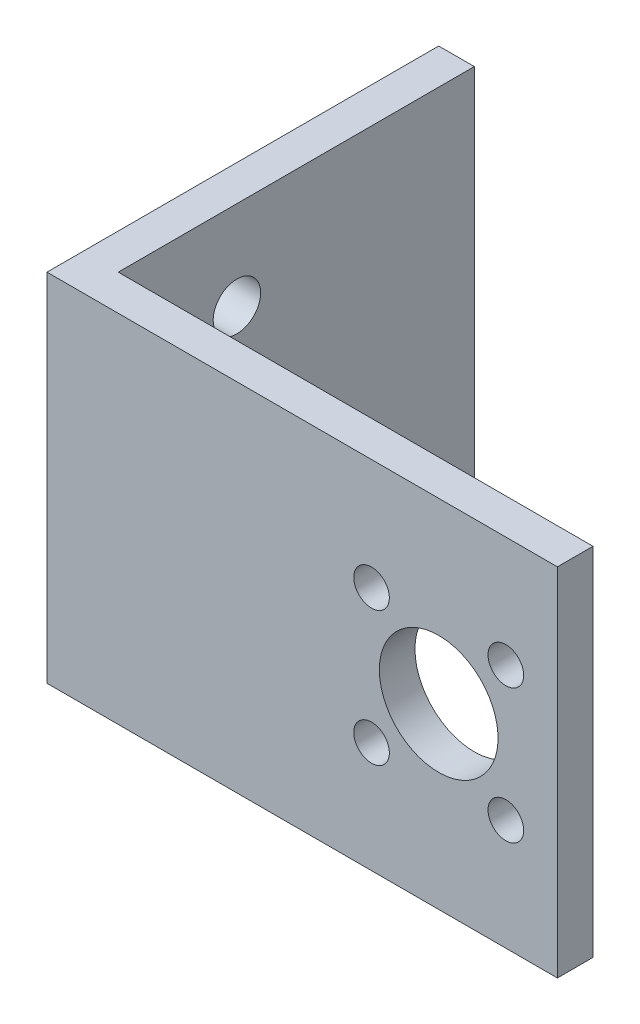
ISO-10303-21;
HEADER;
FILE_DESCRIPTION(('STEP AP214'),'2;1');
FILE_NAME('part.step','',(''),(''),'','','');
FILE_SCHEMA(('AUTOMOTIVE_DESIGN { 1 0 10303 214 1 1 1 1 }'));
ENDSEC;
DATA;
#1=APPLICATION_CONTEXT('core data for automotive mechanical design processes');
#2=APPLICATION_PROTOCOL_DEFINITION('international standard','automotive_design',2000,#1);
#3=PRODUCT_CONTEXT('',#1,'mechanical');
#4=PRODUCT('Part','Part','',(#3));
#5=PRODUCT_RELATED_PRODUCT_CATEGORY('part','',(#4));
#6=PRODUCT_DEFINITION_FORMATION('','',#4);
#7=PRODUCT_DEFINITION_CONTEXT('part definition',#1,'design');
#8=PRODUCT_DEFINITION('design','',#6,#7);
#9=PRODUCT_DEFINITION_SHAPE('','',#8);
#10=(LENGTH_UNIT() NAMED_UNIT(*) SI_UNIT(.MILLI.,.METRE.));
#11=(NAMED_UNIT(*) PLANE_ANGLE_UNIT() SI_UNIT($,.RADIAN.));
#12=(NAMED_UNIT(*) SI_UNIT($,.STERADIAN.) SOLID_ANGLE_UNIT());
#13=UNCERTAINTY_MEASURE_WITH_UNIT(LENGTH_MEASURE(1.E-05),#10,'distance_accuracy_value','');
#14=(GEOMETRIC_REPRESENTATION_CONTEXT(3) GLOBAL_UNCERTAINTY_ASSIGNED_CONTEXT((#13)) GLOBAL_UNIT_ASSIGNED_CONTEXT((#10,
#11,#12)) REPRESENTATION_CONTEXT('',''));
#15=CARTESIAN_POINT('',(0.,0.,0.));
#16=DIRECTION('',(0.,0.,1.));
#17=DIRECTION('',(1.,0.,0.));
#18=AXIS2_PLACEMENT_3D('',#15,#16,#17);
#19=CARTESIAN_POINT('',(0.,30.,-33.));
#20=DIRECTION('',(1.,0.,0.));
#21=DIRECTION('',(0.,0.,-1.));
#22=AXIS2_PLACEMENT_3D('',#19,#20,#21);
#23=PLANE('',#22);
#24=CARTESIAN_POINT('',(0.,22.5,-13.));
#25=DIRECTION('',(-1.,0.,0.));
#26=DIRECTION('',(0.,0.,1.));
#27=AXIS2_PLACEMENT_3D('',#24,#25,#26);
#28=CIRCLE('',#27,2.);
#29=CARTESIAN_POINT('',(0.,22.5,-11.));
#30=VERTEX_POINT('',#29);
#31=EDGE_CURVE('E164',#30,#30,#28,.T.);
#32=ORIENTED_EDGE('',*,*,#31,.F.);
#33=EDGE_LOOP('',(#32));
#34=FACE_BOUND('',#33,.T.);
#35=CARTESIAN_POINT('',(0.,7.5,-13.));
#36=DIRECTION('',(-1.,0.,0.));
#37=DIRECTION('',(0.,0.,1.));
#38=AXIS2_PLACEMENT_3D('',#35,#36,#37);
#39=CIRCLE('',#38,2.);
#40=CARTESIAN_POINT('',(0.,7.5,-11.));
#41=VERTEX_POINT('',#40);
#42=EDGE_CURVE('E167',#41,#41,#39,.T.);
#43=ORIENTED_EDGE('',*,*,#42,.F.);
#44=EDGE_LOOP('',(#43));
#45=FACE_BOUND('',#44,.T.);
#46=DIRECTION('',(0.,0.,1.));
#47=VECTOR('',#46,1.);
#48=CARTESIAN_POINT('',(0.,0.,-33.));
#49=LINE('',#48,#47);
#50=CARTESIAN_POINT('',(0.,0.,-33.));
#51=VERTEX_POINT('',#50);
#52=CARTESIAN_POINT('',(0.,0.,0.));
#53=VERTEX_POINT('',#52);
#54=EDGE_CURVE('E119',#51,#53,#49,.T.);
#55=ORIENTED_EDGE('',*,*,#54,.T.);
#56=DIRECTION('',(0.,-1.,0.));
#57=VECTOR('',#56,1.);
#58=CARTESIAN_POINT('',(0.,30.,0.));
#59=LINE('',#58,#57);
#60=CARTESIAN_POINT('',(0.,30.,0.));
#61=VERTEX_POINT('',#60);
#62=EDGE_CURVE('E11',#61,#53,#59,.T.);
#63=ORIENTED_EDGE('',*,*,#62,.F.);
#64=DIRECTION('',(0.,0.,1.));
#65=VECTOR('',#64,1.);
#66=CARTESIAN_POINT('',(0.,30.,-33.));
#67=LINE('',#66,#65);
#68=CARTESIAN_POINT('',(0.,30.,-33.));
#69=VERTEX_POINT('',#68);
#70=EDGE_CURVE('E130',#69,#61,#67,.T.);
#71=ORIENTED_EDGE('',*,*,#70,.F.);
#72=DIRECTION('',(0.,-1.,0.));
#73=VECTOR('',#72,1.);
#74=CARTESIAN_POINT('',(0.,30.,-33.));
#75=LINE('',#74,#73);
#76=EDGE_CURVE('E115',#69,#51,#75,.T.);
#77=ORIENTED_EDGE('',*,*,#76,.T.);
#78=EDGE_LOOP('',(#55,#63,#71,#77));
#79=FACE_BOUND('',#78,.T.);
#80=ADVANCED_FACE('F35',(#34,#45,#79),#23,.F.);
#81=CARTESIAN_POINT('',(0.,30.,0.));
#82=DIRECTION('',(0.,0.,-1.));
#83=DIRECTION('',(-1.,0.,0.));
#84=AXIS2_PLACEMENT_3D('',#81,#82,#83);
#85=PLANE('',#84);
#86=CARTESIAN_POINT('',(27.3431457505076,20.6568542494924,0.));
#87=DIRECTION('',(0.,0.,-1.));
#88=DIRECTION('',(-1.,0.,0.));
#89=AXIS2_PLACEMENT_3D('',#86,#87,#88);
#90=CIRCLE('',#89,1.5);
#91=CARTESIAN_POINT('',(25.8431457505076,20.6568542494924,0.));
#92=VERTEX_POINT('',#91);
#93=EDGE_CURVE('E203',#92,#92,#90,.F.);
#94=ORIENTED_EDGE('',*,*,#93,.F.);
#95=EDGE_LOOP('',(#94));
#96=FACE_BOUND('',#95,.T.);
#97=CARTESIAN_POINT('',(38.6568542494924,20.6568542494924,0.));
#98=DIRECTION('',(0.,0.,-1.));
#99=DIRECTION('',(-1.,0.,0.));
#100=AXIS2_PLACEMENT_3D('',#97,#98,#99);
#101=CIRCLE('',#100,1.50000000000001);
#102=CARTESIAN_POINT('',(37.1568542494924,20.6568542494924,0.));
#103=VERTEX_POINT('',#102);
#104=EDGE_CURVE('E197',#103,#103,#101,.F.);
#105=ORIENTED_EDGE('',*,*,#104,.F.);
#106=EDGE_LOOP('',(#105));
#107=FACE_BOUND('',#106,.T.);
#108=CARTESIAN_POINT('',(27.3431457505076,9.34314575050764,0.));
#109=DIRECTION('',(0.,0.,-1.));
#110=DIRECTION('',(-1.,0.,0.));
#111=AXIS2_PLACEMENT_3D('',#108,#109,#110);
#112=CIRCLE('',#111,1.5);
#113=CARTESIAN_POINT('',(25.8431457505076,9.34314575050764,0.));
#114=VERTEX_POINT('',#113);
#115=EDGE_CURVE('E191',#114,#114,#112,.F.);
#116=ORIENTED_EDGE('',*,*,#115,.F.);
#117=EDGE_LOOP('',(#116));
#118=FACE_BOUND('',#117,.T.);
#119=CARTESIAN_POINT('',(38.6568542494924,9.34314575050761,0.));
#120=DIRECTION('',(0.,0.,-1.));
#121=DIRECTION('',(-1.,0.,0.));
#122=AXIS2_PLACEMENT_3D('',#119,#120,#121);
#123=CIRCLE('',#122,1.50000000000001);
#124=CARTESIAN_POINT('',(37.1568542494924,9.34314575050761,0.));
#125=VERTEX_POINT('',#124);
#126=EDGE_CURVE('E185',#125,#125,#123,.F.);
#127=ORIENTED_EDGE('',*,*,#126,.F.);
#128=EDGE_LOOP('',(#127));
#129=FACE_BOUND('',#128,.T.);
#130=CARTESIAN_POINT('',(33.,15.,0.));
#131=DIRECTION('',(0.,0.,-1.));
#132=DIRECTION('',(-1.,0.,0.));
#133=AXIS2_PLACEMENT_3D('',#130,#131,#132);
#134=CIRCLE('',#133,5.);
#135=CARTESIAN_POINT('',(28.,15.,0.));
#136=VERTEX_POINT('',#135);
#137=EDGE_CURVE('E179',#136,#136,#134,.F.);
#138=ORIENTED_EDGE('',*,*,#137,.F.);
#139=EDGE_LOOP('',(#138));
#140=FACE_BOUND('',#139,.T.);
#141=DIRECTION('',(1.,0.,0.));
#142=VECTOR('',#141,1.);
#143=CARTESIAN_POINT('',(0.,0.,0.));
#144=LINE('',#143,#142);
#145=CARTESIAN_POINT('',(43.,0.,0.));
#146=VERTEX_POINT('',#145);
#147=EDGE_CURVE('E122',#53,#146,#144,.T.);
#148=ORIENTED_EDGE('',*,*,#147,.T.);
#149=DIRECTION('',(0.,-1.,0.));
#150=VECTOR('',#149,1.);
#151=CARTESIAN_POINT('',(43.,30.,0.));
#152=LINE('',#151,#150);
#153=CARTESIAN_POINT('',(43.,30.,0.));
#154=VERTEX_POINT('',#153);
#155=EDGE_CURVE('E43',#154,#146,#152,.T.);
#156=ORIENTED_EDGE('',*,*,#155,.F.);
#157=DIRECTION('',(1.,0.,0.));
#158=VECTOR('',#157,1.);
#159=CARTESIAN_POINT('',(0.,30.,0.));
#160=LINE('',#159,#158);
#161=EDGE_CURVE('E88',#61,#154,#160,.T.);
#162=ORIENTED_EDGE('',*,*,#161,.F.);
#163=ORIENTED_EDGE('',*,*,#62,.T.);
#164=EDGE_LOOP('',(#148,#156,#162,#163));
#165=FACE_BOUND('',#164,.T.);
#166=ADVANCED_FACE('F155',(#96,#107,#118,#129,#140,#165),#85,.F.);
#167=CARTESIAN_POINT('',(43.,30.,0.));
#168=DIRECTION('',(-1.,0.,0.));
#169=DIRECTION('',(0.,0.,1.));
#170=AXIS2_PLACEMENT_3D('',#167,#168,#169);
#171=PLANE('',#170);
#172=DIRECTION('',(0.,0.,-1.));
#173=VECTOR('',#172,1.);
#174=CARTESIAN_POINT('',(43.,0.,0.));
#175=LINE('',#174,#173);
#176=CARTESIAN_POINT('',(43.,0.,-2.99999999999999));
#177=VERTEX_POINT('',#176);
#178=EDGE_CURVE('E125',#146,#177,#175,.T.);
#179=ORIENTED_EDGE('',*,*,#178,.T.);
#180=DIRECTION('',(0.,-1.,0.));
#181=VECTOR('',#180,1.);
#182=CARTESIAN_POINT('',(43.,30.,-2.99999999999999));
#183=LINE('',#182,#181);
#184=CARTESIAN_POINT('',(43.,30.,-2.99999999999999));
#185=VERTEX_POINT('',#184);
#186=EDGE_CURVE('E110',#185,#177,#183,.T.);
#187=ORIENTED_EDGE('',*,*,#186,.F.);
#188=DIRECTION('',(0.,0.,-1.));
#189=VECTOR('',#188,1.);
#190=CARTESIAN_POINT('',(43.,30.,0.));
#191=LINE('',#190,#189);
#192=EDGE_CURVE('E101',#154,#185,#191,.T.);
#193=ORIENTED_EDGE('',*,*,#192,.F.);
#194=ORIENTED_EDGE('',*,*,#155,.T.);
#195=EDGE_LOOP('',(#179,#187,#193,#194));
#196=FACE_BOUND('',#195,.T.);
#197=ADVANCED_FACE('F136',(#196),#171,.F.);
#198=CARTESIAN_POINT('',(43.,30.,-2.99999999999999));
#199=DIRECTION('',(0.,0.,1.));
#200=DIRECTION('',(1.,0.,0.));
#201=AXIS2_PLACEMENT_3D('',#198,#199,#200);
#202=PLANE('',#201);
#203=CARTESIAN_POINT('',(27.3431457505076,20.6568542494924,-2.99999999999999));
#204=DIRECTION('',(0.,0.,-1.));
#205=DIRECTION('',(-1.,0.,0.));
#206=AXIS2_PLACEMENT_3D('',#203,#204,#205);
#207=CIRCLE('',#206,1.5);
#208=CARTESIAN_POINT('',(25.8431457505076,20.6568542494924,-2.99999999999999));
#209=VERTEX_POINT('',#208);
#210=EDGE_CURVE('E206',#209,#209,#207,.T.);
#211=ORIENTED_EDGE('',*,*,#210,.F.);
#212=EDGE_LOOP('',(#211));
#213=FACE_BOUND('',#212,.T.);
#214=CARTESIAN_POINT('',(38.6568542494924,20.6568542494924,-2.99999999999999));
#215=DIRECTION('',(0.,0.,-1.));
#216=DIRECTION('',(-1.,0.,0.));
#217=AXIS2_PLACEMENT_3D('',#214,#215,#216);
#218=CIRCLE('',#217,1.50000000000001);
#219=CARTESIAN_POINT('',(37.1568542494924,20.6568542494924,-2.99999999999999));
#220=VERTEX_POINT('',#219);
#221=EDGE_CURVE('E200',#220,#220,#218,.T.);
#222=ORIENTED_EDGE('',*,*,#221,.F.);
#223=EDGE_LOOP('',(#222));
#224=FACE_BOUND('',#223,.T.);
#225=CARTESIAN_POINT('',(27.3431457505076,9.34314575050764,-2.99999999999999));
#226=DIRECTION('',(0.,0.,-1.));
#227=DIRECTION('',(-1.,0.,0.));
#228=AXIS2_PLACEMENT_3D('',#225,#226,#227);
#229=CIRCLE('',#228,1.5);
#230=CARTESIAN_POINT('',(25.8431457505076,9.34314575050764,-2.99999999999999));
#231=VERTEX_POINT('',#230);
#232=EDGE_CURVE('E194',#231,#231,#229,.T.);
#233=ORIENTED_EDGE('',*,*,#232,.F.);
#234=EDGE_LOOP('',(#233));
#235=FACE_BOUND('',#234,.T.);
#236=CARTESIAN_POINT('',(38.6568542494924,9.34314575050761,-2.99999999999999));
#237=DIRECTION('',(0.,0.,-1.));
#238=DIRECTION('',(-1.,0.,0.));
#239=AXIS2_PLACEMENT_3D('',#236,#237,#238);
#240=CIRCLE('',#239,1.50000000000001);
#241=CARTESIAN_POINT('',(37.1568542494924,9.34314575050761,-2.99999999999999));
#242=VERTEX_POINT('',#241);
#243=EDGE_CURVE('E188',#242,#242,#240,.T.);
#244=ORIENTED_EDGE('',*,*,#243,.F.);
#245=EDGE_LOOP('',(#244));
#246=FACE_BOUND('',#245,.T.);
#247=CARTESIAN_POINT('',(33.,15.,-2.99999999999999));
#248=DIRECTION('',(0.,0.,-1.));
#249=DIRECTION('',(-1.,0.,0.));
#250=AXIS2_PLACEMENT_3D('',#247,#248,#249);
#251=CIRCLE('',#250,5.);
#252=CARTESIAN_POINT('',(28.,15.,-2.99999999999999));
#253=VERTEX_POINT('',#252);
#254=EDGE_CURVE('E182',#253,#253,#251,.T.);
#255=ORIENTED_EDGE('',*,*,#254,.F.);
#256=EDGE_LOOP('',(#255));
#257=FACE_BOUND('',#256,.T.);
#258=DIRECTION('',(-1.,0.,0.));
#259=VECTOR('',#258,1.);
#260=CARTESIAN_POINT('',(43.,0.,-2.99999999999999));
#261=LINE('',#260,#259);
#262=CARTESIAN_POINT('',(3.,0.,-2.99999999999999));
#263=VERTEX_POINT('',#262);
#264=EDGE_CURVE('E109',#177,#263,#261,.T.);
#265=ORIENTED_EDGE('',*,*,#264,.T.);
#266=DIRECTION('',(0.,-1.,0.));
#267=VECTOR('',#266,1.);
#268=CARTESIAN_POINT('',(3.,30.,-2.99999999999999));
#269=LINE('',#268,#267);
#270=CARTESIAN_POINT('',(3.,30.,-2.99999999999999));
#271=VERTEX_POINT('',#270);
#272=EDGE_CURVE('E106',#271,#263,#269,.T.);
#273=ORIENTED_EDGE('',*,*,#272,.F.);
#274=DIRECTION('',(-1.,0.,0.));
#275=VECTOR('',#274,1.);
#276=CARTESIAN_POINT('',(43.,30.,-2.99999999999999));
#277=LINE('',#276,#275);
#278=EDGE_CURVE('E95',#185,#271,#277,.T.);
#279=ORIENTED_EDGE('',*,*,#278,.F.);
#280=ORIENTED_EDGE('',*,*,#186,.T.);
#281=EDGE_LOOP('',(#265,#273,#279,#280));
#282=FACE_BOUND('',#281,.T.);
#283=ADVANCED_FACE('F107',(#213,#224,#235,#246,#257,#282),#202,.F.);
#284=CARTESIAN_POINT('',(3.,30.,-2.99999999999999));
#285=DIRECTION('',(-1.,0.,0.));
#286=DIRECTION('',(0.,0.,1.));
#287=AXIS2_PLACEMENT_3D('',#284,#285,#286);
#288=PLANE('',#287);
#289=CARTESIAN_POINT('',(3.,22.5,-13.));
#290=DIRECTION('',(-1.,0.,0.));
#291=DIRECTION('',(0.,0.,1.));
#292=AXIS2_PLACEMENT_3D('',#289,#290,#291);
#293=CIRCLE('',#292,2.);
#294=CARTESIAN_POINT('',(3.,22.5,-11.));
#295=VERTEX_POINT('',#294);
#296=EDGE_CURVE('E169',#295,#295,#293,.F.);
#297=ORIENTED_EDGE('',*,*,#296,.F.);
#298=EDGE_LOOP('',(#297));
#299=FACE_BOUND('',#298,.T.);
#300=CARTESIAN_POINT('',(3.,7.5,-13.));
#301=DIRECTION('',(-1.,0.,0.));
#302=DIRECTION('',(0.,0.,1.));
#303=AXIS2_PLACEMENT_3D('',#300,#301,#302);
#304=CIRCLE('',#303,2.);
#305=CARTESIAN_POINT('',(3.,7.5,-11.));
#306=VERTEX_POINT('',#305);
#307=EDGE_CURVE('E123',#306,#306,#304,.F.);
#308=ORIENTED_EDGE('',*,*,#307,.F.);
#309=EDGE_LOOP('',(#308));
#310=FACE_BOUND('',#309,.T.);
#311=DIRECTION('',(0.,0.,-1.));
#312=VECTOR('',#311,1.);
#313=CARTESIAN_POINT('',(3.,0.,-2.99999999999999));
#314=LINE('',#313,#312);
#315=CARTESIAN_POINT('',(2.99999999999999,0.,-33.));
#316=VERTEX_POINT('',#315);
#317=EDGE_CURVE('E74',#263,#316,#314,.T.);
#318=ORIENTED_EDGE('',*,*,#317,.T.);
#319=DIRECTION('',(0.,-1.,0.));
#320=VECTOR('',#319,1.);
#321=CARTESIAN_POINT('',(2.99999999999999,30.,-33.));
#322=LINE('',#321,#320);
#323=CARTESIAN_POINT('',(2.99999999999999,30.,-33.));
#324=VERTEX_POINT('',#323);
#325=EDGE_CURVE('E111',#324,#316,#322,.T.);
#326=ORIENTED_EDGE('',*,*,#325,.F.);
#327=DIRECTION('',(0.,0.,-1.));
#328=VECTOR('',#327,1.);
#329=CARTESIAN_POINT('',(3.,30.,-2.99999999999999));
#330=LINE('',#329,#328);
#331=EDGE_CURVE('E99',#271,#324,#330,.T.);
#332=ORIENTED_EDGE('',*,*,#331,.F.);
#333=ORIENTED_EDGE('',*,*,#272,.T.);
#334=EDGE_LOOP('',(#318,#326,#332,#333));
#335=FACE_BOUND('',#334,.T.);
#336=ADVANCED_FACE('F113',(#299,#310,#335),#288,.F.);
#337=CARTESIAN_POINT('',(2.99999999999999,30.,-33.));
#338=DIRECTION('',(0.,0.,1.));
#339=DIRECTION('',(1.,0.,0.));
#340=AXIS2_PLACEMENT_3D('',#337,#338,#339);
#341=PLANE('',#340);
#342=DIRECTION('',(-1.,0.,0.));
#343=VECTOR('',#342,1.);
#344=CARTESIAN_POINT('',(2.99999999999999,0.,-33.));
#345=LINE('',#344,#343);
#346=EDGE_CURVE('E80',#316,#51,#345,.T.);
#347=ORIENTED_EDGE('',*,*,#346,.T.);
#348=ORIENTED_EDGE('',*,*,#76,.F.);
#349=DIRECTION('',(-1.,0.,0.));
#350=VECTOR('',#349,1.);
#351=CARTESIAN_POINT('',(2.99999999999999,30.,-33.));
#352=LINE('',#351,#350);
#353=EDGE_CURVE('E51',#324,#69,#352,.T.);
#354=ORIENTED_EDGE('',*,*,#353,.F.);
#355=ORIENTED_EDGE('',*,*,#325,.T.);
#356=EDGE_LOOP('',(#347,#348,#354,#355));
#357=FACE_BOUND('',#356,.T.);
#358=ADVANCED_FACE('F143',(#357),#341,.F.);
#359=CARTESIAN_POINT('',(0.,30.,0.));
#360=DIRECTION('',(0.,1.,0.));
#361=DIRECTION('',(0.,0.,1.));
#362=AXIS2_PLACEMENT_3D('',#359,#360,#361);
#363=PLANE('',#362);
#364=ORIENTED_EDGE('',*,*,#70,.T.);
#365=ORIENTED_EDGE('',*,*,#161,.T.);
#366=ORIENTED_EDGE('',*,*,#192,.T.);
#367=ORIENTED_EDGE('',*,*,#278,.T.);
#368=ORIENTED_EDGE('',*,*,#331,.T.);
#369=ORIENTED_EDGE('',*,*,#353,.T.);
#370=EDGE_LOOP('',(#364,#365,#366,#367,#368,#369));
#371=FACE_BOUND('',#370,.T.);
#372=ADVANCED_FACE('F97',(#371),#363,.T.);
#373=CARTESIAN_POINT('',(0.,0.,0.));
#374=DIRECTION('',(0.,1.,0.));
#375=DIRECTION('',(0.,0.,1.));
#376=AXIS2_PLACEMENT_3D('',#373,#374,#375);
#377=PLANE('',#376);
#378=ORIENTED_EDGE('',*,*,#54,.F.);
#379=ORIENTED_EDGE('',*,*,#346,.F.);
#380=ORIENTED_EDGE('',*,*,#317,.F.);
#381=ORIENTED_EDGE('',*,*,#264,.F.);
#382=ORIENTED_EDGE('',*,*,#178,.F.);
#383=ORIENTED_EDGE('',*,*,#147,.F.);
#384=EDGE_LOOP('',(#378,#379,#380,#381,#382,#383));
#385=FACE_BOUND('',#384,.T.);
#386=ADVANCED_FACE('F139',(#385),#377,.F.);
#387=CARTESIAN_POINT('',(43.001,7.5,-13.));
#388=DIRECTION('',(-1.,0.,0.));
#389=DIRECTION('',(0.,0.,1.));
#390=AXIS2_PLACEMENT_3D('',#387,#388,#389);
#391=CYLINDRICAL_SURFACE('',#390,2.);
#392=ORIENTED_EDGE('',*,*,#42,.T.);
#393=EDGE_LOOP('',(#392));
#394=FACE_BOUND('',#393,.T.);
#395=ORIENTED_EDGE('',*,*,#307,.T.);
#396=EDGE_LOOP('',(#395));
#397=FACE_BOUND('',#396,.T.);
#398=ADVANCED_FACE('F239',(#394,#397),#391,.F.);
#399=CARTESIAN_POINT('',(43.001,22.5,-13.));
#400=DIRECTION('',(-1.,0.,0.));
#401=DIRECTION('',(0.,0.,1.));
#402=AXIS2_PLACEMENT_3D('',#399,#400,#401);
#403=CYLINDRICAL_SURFACE('',#402,2.);
#404=ORIENTED_EDGE('',*,*,#31,.T.);
#405=EDGE_LOOP('',(#404));
#406=FACE_BOUND('',#405,.T.);
#407=ORIENTED_EDGE('',*,*,#296,.T.);
#408=EDGE_LOOP('',(#407));
#409=FACE_BOUND('',#408,.T.);
#410=ADVANCED_FACE('F228',(#406,#409),#403,.F.);
#411=CARTESIAN_POINT('',(33.,15.,0.00100000000000143));
#412=DIRECTION('',(0.,0.,-1.));
#413=DIRECTION('',(-1.,0.,0.));
#414=AXIS2_PLACEMENT_3D('',#411,#412,#413);
#415=CYLINDRICAL_SURFACE('',#414,5.);
#416=CARTESIAN_POINT('',(28.,15.,-2.99999999999999));
#417=CARTESIAN_POINT('',(28.,15.,-2.96874999999999));
#418=CARTESIAN_POINT('',(28.,15.,-2.93749999999999));
#419=CARTESIAN_POINT('',(28.,15.,-2.87499999999999));
#420=CARTESIAN_POINT('',(28.,15.,-2.84374999999999));
#421=CARTESIAN_POINT('',(28.,15.,-2.78124999999999));
#422=CARTESIAN_POINT('',(28.,15.,-2.74999999999999));
#423=CARTESIAN_POINT('',(28.,15.,-2.68749999999999));
#424=CARTESIAN_POINT('',(28.,15.,-2.65624999999999));
#425=CARTESIAN_POINT('',(28.,15.,-2.59374999999999));
#426=CARTESIAN_POINT('',(28.,15.,-2.56249999999999));
#427=CARTESIAN_POINT('',(28.,15.,-2.49999999999999));
#428=CARTESIAN_POINT('',(28.,15.,-2.46874999999999));
#429=CARTESIAN_POINT('',(28.,15.,-2.40624999999999));
#430=CARTESIAN_POINT('',(28.,15.,-2.37499999999999));
#431=CARTESIAN_POINT('',(28.,15.,-2.31249999999999));
#432=CARTESIAN_POINT('',(28.,15.,-2.28124999999999));
#433=CARTESIAN_POINT('',(28.,15.,-2.21874999999999));
#434=CARTESIAN_POINT('',(28.,15.,-2.18749999999999));
#435=CARTESIAN_POINT('',(28.,15.,-2.12499999999999));
#436=CARTESIAN_POINT('',(28.,15.,-2.09374999999999));
#437=CARTESIAN_POINT('',(28.,15.,-2.03124999999999));
#438=CARTESIAN_POINT('',(28.,15.,-1.99999999999999));
#439=CARTESIAN_POINT('',(28.,15.,-1.93749999999999));
#440=CARTESIAN_POINT('',(28.,15.,-1.90625));
#441=CARTESIAN_POINT('',(28.,15.,-1.84375));
#442=CARTESIAN_POINT('',(28.,15.,-1.8125));
#443=CARTESIAN_POINT('',(28.,15.,-1.75));
#444=CARTESIAN_POINT('',(28.,15.,-1.71875));
#445=CARTESIAN_POINT('',(28.,15.,-1.65625));
#446=CARTESIAN_POINT('',(28.,15.,-1.625));
#447=CARTESIAN_POINT('',(28.,15.,-1.5625));
#448=CARTESIAN_POINT('',(28.,15.,-1.53125));
#449=CARTESIAN_POINT('',(28.,15.,-1.46875));
#450=CARTESIAN_POINT('',(28.,15.,-1.4375));
#451=CARTESIAN_POINT('',(28.,15.,-1.375));
#452=CARTESIAN_POINT('',(28.,15.,-1.34375));
#453=CARTESIAN_POINT('',(28.,15.,-1.28125));
#454=CARTESIAN_POINT('',(28.,15.,-1.25));
#455=CARTESIAN_POINT('',(28.,15.,-1.1875));
#456=CARTESIAN_POINT('',(28.,15.,-1.15625));
#457=CARTESIAN_POINT('',(28.,15.,-1.09375));
#458=CARTESIAN_POINT('',(28.,15.,-1.0625));
#459=CARTESIAN_POINT('',(28.,15.,-0.999999999999998));
#460=CARTESIAN_POINT('',(28.,15.,-0.968749999999998));
#461=CARTESIAN_POINT('',(28.,15.,-0.906249999999998));
#462=CARTESIAN_POINT('',(28.,15.,-0.874999999999998));
#463=CARTESIAN_POINT('',(28.,15.,-0.812499999999998));
#464=CARTESIAN_POINT('',(28.,15.,-0.781249999999998));
#465=CARTESIAN_POINT('',(28.,15.,-0.718749999999998));
#466=CARTESIAN_POINT('',(28.,15.,-0.687499999999998));
#467=CARTESIAN_POINT('',(28.,15.,-0.624999999999998));
#468=CARTESIAN_POINT('',(28.,15.,-0.593749999999999));
#469=CARTESIAN_POINT('',(28.,15.,-0.531249999999999));
#470=CARTESIAN_POINT('',(28.,15.,-0.499999999999999));
#471=CARTESIAN_POINT('',(28.,15.,-0.437499999999999));
#472=CARTESIAN_POINT('',(28.,15.,-0.406249999999999));
#473=CARTESIAN_POINT('',(28.,15.,-0.343749999999999));
#474=CARTESIAN_POINT('',(28.,15.,-0.312499999999999));
#475=CARTESIAN_POINT('',(28.,15.,-0.25));
#476=CARTESIAN_POINT('',(28.,15.,-0.21875));
#477=CARTESIAN_POINT('',(28.,15.,-0.15625));
#478=CARTESIAN_POINT('',(28.,15.,-0.125));
#479=CARTESIAN_POINT('',(28.,15.,-0.0624999999999999));
#480=CARTESIAN_POINT('',(28.,15.,-0.0312500000000001));
#481=CARTESIAN_POINT('',(28.,15.,0.));
#482=B_SPLINE_CURVE_WITH_KNOTS('',3,(#416,#417,#418,#419,#420,#421,#422,#423,#424,#425,#426,
#427,#428,#429,#430,#431,#432,#433,#434,#435,#436,#437,#438,#439,#440,#441,#442,#443,#444,#445,
#446,#447,#448,#449,#450,#451,#452,#453,#454,#455,#456,#457,#458,#459,#460,#461,#462,#463,#464,
#465,#466,#467,#468,#469,#470,#471,#472,#473,#474,#475,#476,#477,#478,#479,#480,#481),
.UNSPECIFIED.,.F.,.F.,(4,2,2,2,2,2,2,2,2,2,2,2,2,2,2,2,2,2,2,2,2,2,2,2,2,2,2,2,2,2,2,2,4),(0.,
0.0937499999999997,0.1875,0.281249999999999,0.374999999999999,0.468749999999999,
0.562499999999999,0.656249999999998,0.749999999999998,0.843749999999998,0.937499999999998,
1.03125,1.125,1.21875,1.3125,1.40625,1.5,1.59375,1.6875,1.78125,1.87499999999999,
1.96874999999999,2.06249999999999,2.15624999999999,2.24999999999999,2.34374999999999,
2.43749999999999,2.53124999999999,2.62499999999999,2.71874999999999,2.81249999999999,
2.90624999999999,2.99999999999999),.UNSPECIFIED.);
#483=EDGE_CURVE('BSEAM224',#253,#136,#482,.T.);
#484=ORIENTED_EDGE('',*,*,#254,.T.);
#485=ORIENTED_EDGE('',*,*,#137,.T.);
#486=ORIENTED_EDGE('',*,*,#483,.T.);
#487=ORIENTED_EDGE('',*,*,#483,.F.);
#488=EDGE_LOOP('',(#484,#486,#485,#487));
#489=FACE_BOUND('',#488,.T.);
#490=ADVANCED_FACE('F224',(#489),#415,.F.);
#491=CARTESIAN_POINT('',(38.6568542494924,9.34314575050761,0.00100000000000057));
#492=DIRECTION('',(0.,0.,-1.));
#493=DIRECTION('',(-1.,0.,0.));
#494=AXIS2_PLACEMENT_3D('',#491,#492,#493);
#495=CYLINDRICAL_SURFACE('',#494,1.50000000000001);
#496=CARTESIAN_POINT('',(37.1568542494924,9.34314575050761,-2.99999999999999));
#497=CARTESIAN_POINT('',(37.1568542494924,9.34314575050761,-2.96874999999999));
#498=CARTESIAN_POINT('',(37.1568542494924,9.34314575050761,-2.93749999999999));
#499=CARTESIAN_POINT('',(37.1568542494924,9.34314575050761,-2.87499999999999));
#500=CARTESIAN_POINT('',(37.1568542494924,9.34314575050761,-2.84374999999999));
#501=CARTESIAN_POINT('',(37.1568542494924,9.34314575050761,-2.78124999999999));
#502=CARTESIAN_POINT('',(37.1568542494924,9.34314575050761,-2.74999999999999));
#503=CARTESIAN_POINT('',(37.1568542494924,9.34314575050761,-2.68749999999999));
#504=CARTESIAN_POINT('',(37.1568542494924,9.34314575050761,-2.65624999999999));
#505=CARTESIAN_POINT('',(37.1568542494924,9.34314575050761,-2.59374999999999));
#506=CARTESIAN_POINT('',(37.1568542494924,9.34314575050761,-2.56249999999999));
#507=CARTESIAN_POINT('',(37.1568542494924,9.34314575050761,-2.49999999999999));
#508=CARTESIAN_POINT('',(37.1568542494924,9.34314575050761,-2.46874999999999));
#509=CARTESIAN_POINT('',(37.1568542494924,9.34314575050761,-2.40624999999999));
#510=CARTESIAN_POINT('',(37.1568542494924,9.34314575050761,-2.37499999999999));
#511=CARTESIAN_POINT('',(37.1568542494924,9.34314575050761,-2.31249999999999));
#512=CARTESIAN_POINT('',(37.1568542494924,9.34314575050761,-2.28124999999999));
#513=CARTESIAN_POINT('',(37.1568542494924,9.34314575050761,-2.21874999999999));
#514=CARTESIAN_POINT('',(37.1568542494924,9.34314575050761,-2.1875));
#515=CARTESIAN_POINT('',(37.1568542494924,9.34314575050761,-2.125));
#516=CARTESIAN_POINT('',(37.1568542494924,9.34314575050761,-2.09375));
#517=CARTESIAN_POINT('',(37.1568542494924,9.34314575050761,-2.03124999999999));
#518=CARTESIAN_POINT('',(37.1568542494924,9.34314575050761,-2.));
#519=CARTESIAN_POINT('',(37.1568542494924,9.34314575050761,-1.9375));
#520=CARTESIAN_POINT('',(37.1568542494924,9.34314575050761,-1.90625));
#521=CARTESIAN_POINT('',(37.1568542494924,9.34314575050761,-1.84375));
#522=CARTESIAN_POINT('',(37.1568542494924,9.34314575050761,-1.8125));
#523=CARTESIAN_POINT('',(37.1568542494924,9.34314575050761,-1.75));
#524=CARTESIAN_POINT('',(37.1568542494924,9.34314575050761,-1.71875));
#525=CARTESIAN_POINT('',(37.1568542494924,9.34314575050761,-1.65625));
#526=CARTESIAN_POINT('',(37.1568542494924,9.34314575050761,-1.625));
#527=CARTESIAN_POINT('',(37.1568542494924,9.34314575050761,-1.5625));
#528=CARTESIAN_POINT('',(37.1568542494924,9.34314575050761,-1.53125));
#529=CARTESIAN_POINT('',(37.1568542494924,9.34314575050761,-1.46875));
#530=CARTESIAN_POINT('',(37.1568542494924,9.34314575050761,-1.4375));
#531=CARTESIAN_POINT('',(37.1568542494924,9.34314575050761,-1.375));
#532=CARTESIAN_POINT('',(37.1568542494924,9.34314575050761,-1.34375));
#533=CARTESIAN_POINT('',(37.1568542494924,9.34314575050761,-1.28125));
#534=CARTESIAN_POINT('',(37.1568542494924,9.34314575050761,-1.25));
#535=CARTESIAN_POINT('',(37.1568542494924,9.34314575050761,-1.1875));
#536=CARTESIAN_POINT('',(37.1568542494924,9.34314575050761,-1.15625));
#537=CARTESIAN_POINT('',(37.1568542494924,9.34314575050761,-1.09375));
#538=CARTESIAN_POINT('',(37.1568542494924,9.34314575050761,-1.0625));
#539=CARTESIAN_POINT('',(37.1568542494924,9.34314575050761,-0.999999999999997));
#540=CARTESIAN_POINT('',(37.1568542494924,9.34314575050761,-0.968749999999997));
#541=CARTESIAN_POINT('',(37.1568542494924,9.34314575050761,-0.906249999999998));
#542=CARTESIAN_POINT('',(37.1568542494924,9.34314575050761,-0.874999999999998));
#543=CARTESIAN_POINT('',(37.1568542494924,9.34314575050761,-0.812499999999998));
#544=CARTESIAN_POINT('',(37.1568542494924,9.34314575050761,-0.781249999999998));
#545=CARTESIAN_POINT('',(37.1568542494924,9.34314575050761,-0.718749999999998));
#546=CARTESIAN_POINT('',(37.1568542494924,9.34314575050761,-0.687499999999998));
#547=CARTESIAN_POINT('',(37.1568542494924,9.34314575050761,-0.624999999999998));
#548=CARTESIAN_POINT('',(37.1568542494924,9.34314575050761,-0.593749999999998));
#549=CARTESIAN_POINT('',(37.1568542494924,9.34314575050761,-0.531249999999999));
#550=CARTESIAN_POINT('',(37.1568542494924,9.34314575050761,-0.499999999999999));
#551=CARTESIAN_POINT('',(37.1568542494924,9.34314575050761,-0.437499999999999));
#552=CARTESIAN_POINT('',(37.1568542494924,9.34314575050761,-0.406249999999999));
#553=CARTESIAN_POINT('',(37.1568542494924,9.34314575050761,-0.343749999999999));
#554=CARTESIAN_POINT('',(37.1568542494924,9.34314575050761,-0.312499999999999));
#555=CARTESIAN_POINT('',(37.1568542494924,9.34314575050761,-0.249999999999999));
#556=CARTESIAN_POINT('',(37.1568542494924,9.34314575050761,-0.218749999999999));
#557=CARTESIAN_POINT('',(37.1568542494924,9.34314575050761,-0.156249999999999));
#558=CARTESIAN_POINT('',(37.1568542494924,9.34314575050761,-0.124999999999999));
#559=CARTESIAN_POINT('',(37.1568542494924,9.34314575050761,-0.0624999999999995));
#560=CARTESIAN_POINT('',(37.1568542494924,9.34314575050761,-0.0312499999999997));
#561=CARTESIAN_POINT('',(37.1568542494924,9.34314575050761,0.));
#562=B_SPLINE_CURVE_WITH_KNOTS('',3,(#496,#497,#498,#499,#500,#501,#502,#503,#504,#505,#506,
#507,#508,#509,#510,#511,#512,#513,#514,#515,#516,#517,#518,#519,#520,#521,#522,#523,#524,#525,
#526,#527,#528,#529,#530,#531,#532,#533,#534,#535,#536,#537,#538,#539,#540,#541,#542,#543,#544,
#545,#546,#547,#548,#549,#550,#551,#552,#553,#554,#555,#556,#557,#558,#559,#560,#561),
.UNSPECIFIED.,.F.,.F.,(4,2,2,2,2,2,2,2,2,2,2,2,2,2,2,2,2,2,2,2,2,2,2,2,2,2,2,2,2,2,2,2,4),(0.,
0.0937499999999997,0.1875,0.281249999999999,0.374999999999999,0.468749999999999,
0.562499999999999,0.656249999999999,0.749999999999998,0.843749999999998,0.937499999999998,
1.03125,1.125,1.21875,1.3125,1.40625,1.5,1.59375,1.6875,1.78125,1.875,1.96875,2.0625,2.15625,
2.25,2.34375,2.43749999999999,2.53124999999999,2.62499999999999,2.71874999999999,
2.81249999999999,2.90624999999999,2.99999999999999),.UNSPECIFIED.);
#563=EDGE_CURVE('BSEAM227',#242,#125,#562,.T.);
#564=ORIENTED_EDGE('',*,*,#243,.T.);
#565=ORIENTED_EDGE('',*,*,#126,.T.);
#566=ORIENTED_EDGE('',*,*,#563,.T.);
#567=ORIENTED_EDGE('',*,*,#563,.F.);
#568=EDGE_LOOP('',(#564,#566,#565,#567));
#569=FACE_BOUND('',#568,.T.);
#570=ADVANCED_FACE('F227',(#569),#495,.F.);
#571=CARTESIAN_POINT('',(27.3431457505076,9.34314575050764,0.0010000000000023));
#572=DIRECTION('',(0.,0.,-1.));
#573=DIRECTION('',(-1.,0.,0.));
#574=AXIS2_PLACEMENT_3D('',#571,#572,#573);
#575=CYLINDRICAL_SURFACE('',#574,1.5);
#576=CARTESIAN_POINT('',(25.8431457505076,9.34314575050764,-2.99999999999999));
#577=CARTESIAN_POINT('',(25.8431457505076,9.34314575050764,-2.96874999999999));
#578=CARTESIAN_POINT('',(25.8431457505076,9.34314575050764,-2.93749999999999));
#579=CARTESIAN_POINT('',(25.8431457505076,9.34314575050764,-2.87499999999999));
#580=CARTESIAN_POINT('',(25.8431457505076,9.34314575050764,-2.84374999999999));
#581=CARTESIAN_POINT('',(25.8431457505076,9.34314575050764,-2.78124999999999));
#582=CARTESIAN_POINT('',(25.8431457505076,9.34314575050764,-2.74999999999999));
#583=CARTESIAN_POINT('',(25.8431457505076,9.34314575050764,-2.68749999999999));
#584=CARTESIAN_POINT('',(25.8431457505076,9.34314575050764,-2.65624999999999));
#585=CARTESIAN_POINT('',(25.8431457505076,9.34314575050764,-2.59374999999999));
#586=CARTESIAN_POINT('',(25.8431457505076,9.34314575050764,-2.56249999999999));
#587=CARTESIAN_POINT('',(25.8431457505076,9.34314575050764,-2.49999999999999));
#588=CARTESIAN_POINT('',(25.8431457505076,9.34314575050764,-2.46874999999999));
#589=CARTESIAN_POINT('',(25.8431457505076,9.34314575050764,-2.40624999999999));
#590=CARTESIAN_POINT('',(25.8431457505076,9.34314575050764,-2.37499999999999));
#591=CARTESIAN_POINT('',(25.8431457505076,9.34314575050764,-2.31249999999999));
#592=CARTESIAN_POINT('',(25.8431457505076,9.34314575050764,-2.28124999999999));
#593=CARTESIAN_POINT('',(25.8431457505076,9.34314575050764,-2.21874999999999));
#594=CARTESIAN_POINT('',(25.8431457505076,9.34314575050764,-2.18749999999999));
#595=CARTESIAN_POINT('',(25.8431457505076,9.34314575050764,-2.12499999999999));
#596=CARTESIAN_POINT('',(25.8431457505076,9.34314575050764,-2.09374999999999));
#597=CARTESIAN_POINT('',(25.8431457505076,9.34314575050764,-2.03124999999999));
#598=CARTESIAN_POINT('',(25.8431457505076,9.34314575050764,-1.99999999999999));
#599=CARTESIAN_POINT('',(25.8431457505076,9.34314575050764,-1.93749999999999));
#600=CARTESIAN_POINT('',(25.8431457505076,9.34314575050764,-1.90624999999999));
#601=CARTESIAN_POINT('',(25.8431457505076,9.34314575050764,-1.84374999999999));
#602=CARTESIAN_POINT('',(25.8431457505076,9.34314575050764,-1.81249999999999));
#603=CARTESIAN_POINT('',(25.8431457505076,9.34314575050764,-1.74999999999999));
#604=CARTESIAN_POINT('',(25.8431457505076,9.34314575050764,-1.71874999999999));
#605=CARTESIAN_POINT('',(25.8431457505076,9.34314575050764,-1.65624999999999));
#606=CARTESIAN_POINT('',(25.8431457505076,9.34314575050764,-1.625));
#607=CARTESIAN_POINT('',(25.8431457505076,9.34314575050764,-1.5625));
#608=CARTESIAN_POINT('',(25.8431457505076,9.34314575050764,-1.53125));
#609=CARTESIAN_POINT('',(25.8431457505076,9.34314575050764,-1.46875));
#610=CARTESIAN_POINT('',(25.8431457505076,9.34314575050764,-1.4375));
#611=CARTESIAN_POINT('',(25.8431457505076,9.34314575050764,-1.375));
#612=CARTESIAN_POINT('',(25.8431457505076,9.34314575050764,-1.34375));
#613=CARTESIAN_POINT('',(25.8431457505076,9.34314575050764,-1.28125));
#614=CARTESIAN_POINT('',(25.8431457505076,9.34314575050764,-1.25));
#615=CARTESIAN_POINT('',(25.8431457505076,9.34314575050764,-1.1875));
#616=CARTESIAN_POINT('',(25.8431457505076,9.34314575050764,-1.15625));
#617=CARTESIAN_POINT('',(25.8431457505076,9.34314575050764,-1.09375));
#618=CARTESIAN_POINT('',(25.8431457505076,9.34314575050764,-1.0625));
#619=CARTESIAN_POINT('',(25.8431457505076,9.34314575050764,-0.999999999999997));
#620=CARTESIAN_POINT('',(25.8431457505076,9.34314575050764,-0.968749999999997));
#621=CARTESIAN_POINT('',(25.8431457505076,9.34314575050764,-0.906249999999997));
#622=CARTESIAN_POINT('',(25.8431457505076,9.34314575050764,-0.874999999999997));
#623=CARTESIAN_POINT('',(25.8431457505076,9.34314575050764,-0.812499999999997));
#624=CARTESIAN_POINT('',(25.8431457505076,9.34314575050764,-0.781249999999998));
#625=CARTESIAN_POINT('',(25.8431457505076,9.34314575050764,-0.718749999999998));
#626=CARTESIAN_POINT('',(25.8431457505076,9.34314575050764,-0.687499999999998));
#627=CARTESIAN_POINT('',(25.8431457505076,9.34314575050764,-0.624999999999998));
#628=CARTESIAN_POINT('',(25.8431457505076,9.34314575050764,-0.593749999999998));
#629=CARTESIAN_POINT('',(25.8431457505076,9.34314575050764,-0.531249999999998));
#630=CARTESIAN_POINT('',(25.8431457505076,9.34314575050764,-0.499999999999998));
#631=CARTESIAN_POINT('',(25.8431457505076,9.34314575050764,-0.437499999999999));
#632=CARTESIAN_POINT('',(25.8431457505076,9.34314575050764,-0.406249999999999));
#633=CARTESIAN_POINT('',(25.8431457505076,9.34314575050764,-0.343749999999999));
#634=CARTESIAN_POINT('',(25.8431457505076,9.34314575050764,-0.312499999999999));
#635=CARTESIAN_POINT('',(25.8431457505076,9.34314575050764,-0.249999999999999));
#636=CARTESIAN_POINT('',(25.8431457505076,9.34314575050764,-0.218749999999999));
#637=CARTESIAN_POINT('',(25.8431457505076,9.34314575050764,-0.156249999999999));
#638=CARTESIAN_POINT('',(25.8431457505076,9.34314575050764,-0.124999999999999));
#639=CARTESIAN_POINT('',(25.8431457505076,9.34314575050764,-0.0624999999999995));
#640=CARTESIAN_POINT('',(25.8431457505076,9.34314575050764,-0.0312499999999996));
#641=CARTESIAN_POINT('',(25.8431457505076,9.34314575050764,0.));
#642=B_SPLINE_CURVE_WITH_KNOTS('',3,(#576,#577,#578,#579,#580,#581,#582,#583,#584,#585,#586,
#587,#588,#589,#590,#591,#592,#593,#594,#595,#596,#597,#598,#599,#600,#601,#602,#603,#604,#605,
#606,#607,#608,#609,#610,#611,#612,#613,#614,#615,#616,#617,#618,#619,#620,#621,#622,#623,#624,
#625,#626,#627,#628,#629,#630,#631,#632,#633,#634,#635,#636,#637,#638,#639,#640,#641),
.UNSPECIFIED.,.F.,.F.,(4,2,2,2,2,2,2,2,2,2,2,2,2,2,2,2,2,2,2,2,2,2,2,2,2,2,2,2,2,2,2,2,4),(0.,
0.0937499999999997,0.187499999999999,0.281249999999999,0.374999999999999,0.468749999999999,
0.562499999999998,0.656249999999998,0.749999999999998,0.843749999999998,0.937499999999997,
1.03125,1.125,1.21875,1.3125,1.40625,1.5,1.59375,1.6875,1.78125,1.87499999999999,
1.96874999999999,2.06249999999999,2.15624999999999,2.24999999999999,2.34374999999999,
2.43749999999999,2.53124999999999,2.62499999999999,2.71874999999999,2.81249999999999,
2.90624999999999,2.99999999999999),.UNSPECIFIED.);
#643=EDGE_CURVE('BSEAM236',#231,#114,#642,.T.);
#644=ORIENTED_EDGE('',*,*,#232,.T.);
#645=ORIENTED_EDGE('',*,*,#115,.T.);
#646=ORIENTED_EDGE('',*,*,#643,.T.);
#647=ORIENTED_EDGE('',*,*,#643,.F.);
#648=EDGE_LOOP('',(#644,#646,#645,#647));
#649=FACE_BOUND('',#648,.T.);
#650=ADVANCED_FACE('F236',(#649),#575,.F.);
#651=CARTESIAN_POINT('',(38.6568542494924,20.6568542494924,0.00100000000000057));
#652=DIRECTION('',(0.,0.,-1.));
#653=DIRECTION('',(-1.,0.,0.));
#654=AXIS2_PLACEMENT_3D('',#651,#652,#653);
#655=CYLINDRICAL_SURFACE('',#654,1.50000000000001);
#656=CARTESIAN_POINT('',(37.1568542494924,20.6568542494924,-2.99999999999999));
#657=CARTESIAN_POINT('',(37.1568542494924,20.6568542494924,-2.96874999999999));
#658=CARTESIAN_POINT('',(37.1568542494924,20.6568542494924,-2.93749999999999));
#659=CARTESIAN_POINT('',(37.1568542494924,20.6568542494924,-2.87499999999999));
#660=CARTESIAN_POINT('',(37.1568542494924,20.6568542494924,-2.84374999999999));
#661=CARTESIAN_POINT('',(37.1568542494924,20.6568542494924,-2.78124999999999));
#662=CARTESIAN_POINT('',(37.1568542494924,20.6568542494924,-2.74999999999999));
#663=CARTESIAN_POINT('',(37.1568542494924,20.6568542494924,-2.68749999999999));
#664=CARTESIAN_POINT('',(37.1568542494924,20.6568542494924,-2.65624999999999));
#665=CARTESIAN_POINT('',(37.1568542494924,20.6568542494924,-2.59374999999999));
#666=CARTESIAN_POINT('',(37.1568542494924,20.6568542494924,-2.56249999999999));
#667=CARTESIAN_POINT('',(37.1568542494924,20.6568542494924,-2.49999999999999));
#668=CARTESIAN_POINT('',(37.1568542494924,20.6568542494924,-2.46874999999999));
#669=CARTESIAN_POINT('',(37.1568542494924,20.6568542494924,-2.40624999999999));
#670=CARTESIAN_POINT('',(37.1568542494924,20.6568542494924,-2.37499999999999));
#671=CARTESIAN_POINT('',(37.1568542494924,20.6568542494924,-2.31249999999999));
#672=CARTESIAN_POINT('',(37.1568542494924,20.6568542494924,-2.28124999999999));
#673=CARTESIAN_POINT('',(37.1568542494924,20.6568542494924,-2.21874999999999));
#674=CARTESIAN_POINT('',(37.1568542494924,20.6568542494924,-2.1875));
#675=CARTESIAN_POINT('',(37.1568542494924,20.6568542494924,-2.125));
#676=CARTESIAN_POINT('',(37.1568542494924,20.6568542494924,-2.09375));
#677=CARTESIAN_POINT('',(37.1568542494924,20.6568542494924,-2.03124999999999));
#678=CARTESIAN_POINT('',(37.1568542494924,20.6568542494924,-2.));
#679=CARTESIAN_POINT('',(37.1568542494924,20.6568542494924,-1.9375));
#680=CARTESIAN_POINT('',(37.1568542494924,20.6568542494924,-1.90625));
#681=CARTESIAN_POINT('',(37.1568542494924,20.6568542494924,-1.84375));
#682=CARTESIAN_POINT('',(37.1568542494924,20.6568542494924,-1.8125));
#683=CARTESIAN_POINT('',(37.1568542494924,20.6568542494924,-1.75));
#684=CARTESIAN_POINT('',(37.1568542494924,20.6568542494924,-1.71875));
#685=CARTESIAN_POINT('',(37.1568542494924,20.6568542494924,-1.65625));
#686=CARTESIAN_POINT('',(37.1568542494924,20.6568542494924,-1.625));
#687=CARTESIAN_POINT('',(37.1568542494924,20.6568542494924,-1.5625));
#688=CARTESIAN_POINT('',(37.1568542494924,20.6568542494924,-1.53125));
#689=CARTESIAN_POINT('',(37.1568542494924,20.6568542494924,-1.46875));
#690=CARTESIAN_POINT('',(37.1568542494924,20.6568542494924,-1.4375));
#691=CARTESIAN_POINT('',(37.1568542494924,20.6568542494924,-1.375));
#692=CARTESIAN_POINT('',(37.1568542494924,20.6568542494924,-1.34375));
#693=CARTESIAN_POINT('',(37.1568542494924,20.6568542494924,-1.28125));
#694=CARTESIAN_POINT('',(37.1568542494924,20.6568542494924,-1.25));
#695=CARTESIAN_POINT('',(37.1568542494924,20.6568542494924,-1.1875));
#696=CARTESIAN_POINT('',(37.1568542494924,20.6568542494924,-1.15625));
#697=CARTESIAN_POINT('',(37.1568542494924,20.6568542494924,-1.09375));
#698=CARTESIAN_POINT('',(37.1568542494924,20.6568542494924,-1.0625));
#699=CARTESIAN_POINT('',(37.1568542494924,20.6568542494924,-0.999999999999997));
#700=CARTESIAN_POINT('',(37.1568542494924,20.6568542494924,-0.968749999999997));
#701=CARTESIAN_POINT('',(37.1568542494924,20.6568542494924,-0.906249999999998));
#702=CARTESIAN_POINT('',(37.1568542494924,20.6568542494924,-0.874999999999998));
#703=CARTESIAN_POINT('',(37.1568542494924,20.6568542494924,-0.812499999999998));
#704=CARTESIAN_POINT('',(37.1568542494924,20.6568542494924,-0.781249999999998));
#705=CARTESIAN_POINT('',(37.1568542494924,20.6568542494924,-0.718749999999998));
#706=CARTESIAN_POINT('',(37.1568542494924,20.6568542494924,-0.687499999999998));
#707=CARTESIAN_POINT('',(37.1568542494924,20.6568542494924,-0.624999999999998));
#708=CARTESIAN_POINT('',(37.1568542494924,20.6568542494924,-0.593749999999998));
#709=CARTESIAN_POINT('',(37.1568542494924,20.6568542494924,-0.531249999999999));
#710=CARTESIAN_POINT('',(37.1568542494924,20.6568542494924,-0.499999999999999));
#711=CARTESIAN_POINT('',(37.1568542494924,20.6568542494924,-0.437499999999999));
#712=CARTESIAN_POINT('',(37.1568542494924,20.6568542494924,-0.406249999999999));
#713=CARTESIAN_POINT('',(37.1568542494924,20.6568542494924,-0.343749999999999));
#714=CARTESIAN_POINT('',(37.1568542494924,20.6568542494924,-0.312499999999999));
#715=CARTESIAN_POINT('',(37.1568542494924,20.6568542494924,-0.249999999999999));
#716=CARTESIAN_POINT('',(37.1568542494924,20.6568542494924,-0.218749999999999));
#717=CARTESIAN_POINT('',(37.1568542494924,20.6568542494924,-0.156249999999999));
#718=CARTESIAN_POINT('',(37.1568542494924,20.6568542494924,-0.124999999999999));
#719=CARTESIAN_POINT('',(37.1568542494924,20.6568542494924,-0.0624999999999995));
#720=CARTESIAN_POINT('',(37.1568542494924,20.6568542494924,-0.0312499999999997));
#721=CARTESIAN_POINT('',(37.1568542494924,20.6568542494924,0.));
#722=B_SPLINE_CURVE_WITH_KNOTS('',3,(#656,#657,#658,#659,#660,#661,#662,#663,#664,#665,#666,
#667,#668,#669,#670,#671,#672,#673,#674,#675,#676,#677,#678,#679,#680,#681,#682,#683,#684,#685,
#686,#687,#688,#689,#690,#691,#692,#693,#694,#695,#696,#697,#698,#699,#700,#701,#702,#703,#704,
#705,#706,#707,#708,#709,#710,#711,#712,#713,#714,#715,#716,#717,#718,#719,#720,#721),
.UNSPECIFIED.,.F.,.F.,(4,2,2,2,2,2,2,2,2,2,2,2,2,2,2,2,2,2,2,2,2,2,2,2,2,2,2,2,2,2,2,2,4),(0.,
0.0937499999999997,0.1875,0.281249999999999,0.374999999999999,0.468749999999999,
0.562499999999999,0.656249999999999,0.749999999999998,0.843749999999998,0.937499999999998,
1.03125,1.125,1.21875,1.3125,1.40625,1.5,1.59375,1.6875,1.78125,1.875,1.96875,2.0625,2.15625,
2.25,2.34375,2.43749999999999,2.53124999999999,2.62499999999999,2.71874999999999,
2.81249999999999,2.90624999999999,2.99999999999999),.UNSPECIFIED.);
#723=EDGE_CURVE('BSEAM294',#220,#103,#722,.T.);
#724=ORIENTED_EDGE('',*,*,#221,.T.);
#725=ORIENTED_EDGE('',*,*,#104,.T.);
#726=ORIENTED_EDGE('',*,*,#723,.T.);
#727=ORIENTED_EDGE('',*,*,#723,.F.);
#728=EDGE_LOOP('',(#724,#726,#725,#727));
#729=FACE_BOUND('',#728,.T.);
#730=ADVANCED_FACE('F294',(#729),#655,.F.);
#731=CARTESIAN_POINT('',(27.3431457505076,20.6568542494924,0.0010000000000023));
#732=DIRECTION('',(0.,0.,-1.));
#733=DIRECTION('',(-1.,0.,0.));
#734=AXIS2_PLACEMENT_3D('',#731,#732,#733);
#735=CYLINDRICAL_SURFACE('',#734,1.5);
#736=CARTESIAN_POINT('',(25.8431457505076,20.6568542494924,-2.99999999999999));
#737=CARTESIAN_POINT('',(25.8431457505076,20.6568542494924,-2.96874999999999));
#738=CARTESIAN_POINT('',(25.8431457505076,20.6568542494924,-2.93749999999999));
#739=CARTESIAN_POINT('',(25.8431457505076,20.6568542494924,-2.87499999999999));
#740=CARTESIAN_POINT('',(25.8431457505076,20.6568542494924,-2.84374999999999));
#741=CARTESIAN_POINT('',(25.8431457505076,20.6568542494924,-2.78124999999999));
#742=CARTESIAN_POINT('',(25.8431457505076,20.6568542494924,-2.74999999999999));
#743=CARTESIAN_POINT('',(25.8431457505076,20.6568542494924,-2.68749999999999));
#744=CARTESIAN_POINT('',(25.8431457505076,20.6568542494924,-2.65624999999999));
#745=CARTESIAN_POINT('',(25.8431457505076,20.6568542494924,-2.59374999999999));
#746=CARTESIAN_POINT('',(25.8431457505076,20.6568542494924,-2.56249999999999));
#747=CARTESIAN_POINT('',(25.8431457505076,20.6568542494924,-2.49999999999999));
#748=CARTESIAN_POINT('',(25.8431457505076,20.6568542494924,-2.46874999999999));
#749=CARTESIAN_POINT('',(25.8431457505076,20.6568542494924,-2.40624999999999));
#750=CARTESIAN_POINT('',(25.8431457505076,20.6568542494924,-2.37499999999999));
#751=CARTESIAN_POINT('',(25.8431457505076,20.6568542494924,-2.31249999999999));
#752=CARTESIAN_POINT('',(25.8431457505076,20.6568542494924,-2.28124999999999));
#753=CARTESIAN_POINT('',(25.8431457505076,20.6568542494924,-2.21874999999999));
#754=CARTESIAN_POINT('',(25.8431457505076,20.6568542494924,-2.18749999999999));
#755=CARTESIAN_POINT('',(25.8431457505076,20.6568542494924,-2.12499999999999));
#756=CARTESIAN_POINT('',(25.8431457505076,20.6568542494924,-2.09374999999999));
#757=CARTESIAN_POINT('',(25.8431457505076,20.6568542494924,-2.03124999999999));
#758=CARTESIAN_POINT('',(25.8431457505076,20.6568542494924,-1.99999999999999));
#759=CARTESIAN_POINT('',(25.8431457505076,20.6568542494924,-1.93749999999999));
#760=CARTESIAN_POINT('',(25.8431457505076,20.6568542494924,-1.90624999999999));
#761=CARTESIAN_POINT('',(25.8431457505076,20.6568542494924,-1.84374999999999));
#762=CARTESIAN_POINT('',(25.8431457505076,20.6568542494924,-1.81249999999999));
#763=CARTESIAN_POINT('',(25.8431457505076,20.6568542494924,-1.74999999999999));
#764=CARTESIAN_POINT('',(25.8431457505076,20.6568542494924,-1.71874999999999));
#765=CARTESIAN_POINT('',(25.8431457505076,20.6568542494924,-1.65624999999999));
#766=CARTESIAN_POINT('',(25.8431457505076,20.6568542494924,-1.625));
#767=CARTESIAN_POINT('',(25.8431457505076,20.6568542494924,-1.5625));
#768=CARTESIAN_POINT('',(25.8431457505076,20.6568542494924,-1.53125));
#769=CARTESIAN_POINT('',(25.8431457505076,20.6568542494924,-1.46875));
#770=CARTESIAN_POINT('',(25.8431457505076,20.6568542494924,-1.4375));
#771=CARTESIAN_POINT('',(25.8431457505076,20.6568542494924,-1.375));
#772=CARTESIAN_POINT('',(25.8431457505076,20.6568542494924,-1.34375));
#773=CARTESIAN_POINT('',(25.8431457505076,20.6568542494924,-1.28125));
#774=CARTESIAN_POINT('',(25.8431457505076,20.6568542494924,-1.25));
#775=CARTESIAN_POINT('',(25.8431457505076,20.6568542494924,-1.1875));
#776=CARTESIAN_POINT('',(25.8431457505076,20.6568542494924,-1.15625));
#777=CARTESIAN_POINT('',(25.8431457505076,20.6568542494924,-1.09375));
#778=CARTESIAN_POINT('',(25.8431457505076,20.6568542494924,-1.0625));
#779=CARTESIAN_POINT('',(25.8431457505076,20.6568542494924,-0.999999999999997));
#780=CARTESIAN_POINT('',(25.8431457505076,20.6568542494924,-0.968749999999997));
#781=CARTESIAN_POINT('',(25.8431457505076,20.6568542494924,-0.906249999999997));
#782=CARTESIAN_POINT('',(25.8431457505076,20.6568542494924,-0.874999999999997));
#783=CARTESIAN_POINT('',(25.8431457505076,20.6568542494924,-0.812499999999997));
#784=CARTESIAN_POINT('',(25.8431457505076,20.6568542494924,-0.781249999999998));
#785=CARTESIAN_POINT('',(25.8431457505076,20.6568542494924,-0.718749999999998));
#786=CARTESIAN_POINT('',(25.8431457505076,20.6568542494924,-0.687499999999998));
#787=CARTESIAN_POINT('',(25.8431457505076,20.6568542494924,-0.624999999999998));
#788=CARTESIAN_POINT('',(25.8431457505076,20.6568542494924,-0.593749999999998));
#789=CARTESIAN_POINT('',(25.8431457505076,20.6568542494924,-0.531249999999998));
#790=CARTESIAN_POINT('',(25.8431457505076,20.6568542494924,-0.499999999999998));
#791=CARTESIAN_POINT('',(25.8431457505076,20.6568542494924,-0.437499999999999));
#792=CARTESIAN_POINT('',(25.8431457505076,20.6568542494924,-0.406249999999999));
#793=CARTESIAN_POINT('',(25.8431457505076,20.6568542494924,-0.343749999999999));
#794=CARTESIAN_POINT('',(25.8431457505076,20.6568542494924,-0.312499999999999));
#795=CARTESIAN_POINT('',(25.8431457505076,20.6568542494924,-0.249999999999999));
#796=CARTESIAN_POINT('',(25.8431457505076,20.6568542494924,-0.218749999999999));
#797=CARTESIAN_POINT('',(25.8431457505076,20.6568542494924,-0.156249999999999));
#798=CARTESIAN_POINT('',(25.8431457505076,20.6568542494924,-0.124999999999999));
#799=CARTESIAN_POINT('',(25.8431457505076,20.6568542494924,-0.0624999999999995));
#800=CARTESIAN_POINT('',(25.8431457505076,20.6568542494924,-0.0312499999999996));
#801=CARTESIAN_POINT('',(25.8431457505076,20.6568542494924,0.));
#802=B_SPLINE_CURVE_WITH_KNOTS('',3,(#736,#737,#738,#739,#740,#741,#742,#743,#744,#745,#746,
#747,#748,#749,#750,#751,#752,#753,#754,#755,#756,#757,#758,#759,#760,#761,#762,#763,#764,#765,
#766,#767,#768,#769,#770,#771,#772,#773,#774,#775,#776,#777,#778,#779,#780,#781,#782,#783,#784,
#785,#786,#787,#788,#789,#790,#791,#792,#793,#794,#795,#796,#797,#798,#799,#800,#801),
.UNSPECIFIED.,.F.,.F.,(4,2,2,2,2,2,2,2,2,2,2,2,2,2,2,2,2,2,2,2,2,2,2,2,2,2,2,2,2,2,2,2,4),(0.,
0.0937499999999997,0.187499999999999,0.281249999999999,0.374999999999999,0.468749999999999,
0.562499999999998,0.656249999999998,0.749999999999998,0.843749999999998,0.937499999999997,
1.03125,1.125,1.21875,1.3125,1.40625,1.5,1.59375,1.6875,1.78125,1.87499999999999,
1.96874999999999,2.06249999999999,2.15624999999999,2.24999999999999,2.34374999999999,
2.43749999999999,2.53124999999999,2.62499999999999,2.71874999999999,2.81249999999999,
2.90624999999999,2.99999999999999),.UNSPECIFIED.);
#803=EDGE_CURVE('BSEAM210',#209,#92,#802,.T.);
#804=ORIENTED_EDGE('',*,*,#210,.T.);
#805=ORIENTED_EDGE('',*,*,#93,.T.);
#806=ORIENTED_EDGE('',*,*,#803,.T.);
#807=ORIENTED_EDGE('',*,*,#803,.F.);
#808=EDGE_LOOP('',(#804,#806,#805,#807));
#809=FACE_BOUND('',#808,.T.);
#810=ADVANCED_FACE('F210',(#809),#735,.F.);
#811=CLOSED_SHELL('',(#80,#166,#197,#283,#336,#358,#372,#386,#398,#410,#490,#570,#650,#730,#810));
#812=MANIFOLD_SOLID_BREP('B2',#811);
#813=ADVANCED_BREP_SHAPE_REPRESENTATION('',(#18,#812),#14);
#814=SHAPE_DEFINITION_REPRESENTATION(#9,#813);
ENDSEC;
END-ISO-10303-21;
